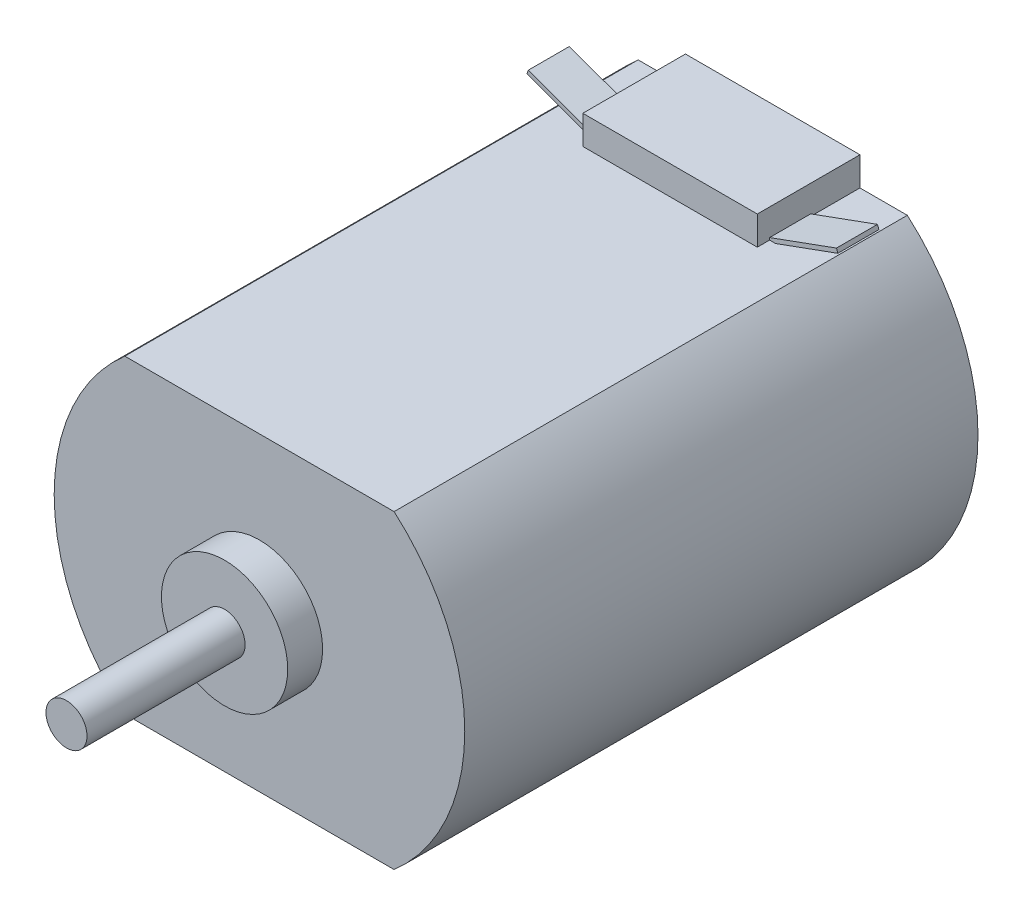
ISO-10303-21;
HEADER;
FILE_DESCRIPTION(('STEP AP214'),'2;1');
FILE_NAME('part.step','',(''),(''),'','','');
FILE_SCHEMA(('AUTOMOTIVE_DESIGN { 1 0 10303 214 1 1 1 1 }'));
ENDSEC;
DATA;
#1=APPLICATION_CONTEXT('core data for automotive mechanical design processes');
#2=APPLICATION_PROTOCOL_DEFINITION('international standard','automotive_design',2000,#1);
#3=PRODUCT_CONTEXT('',#1,'mechanical');
#4=PRODUCT('Part','Part','',(#3));
#5=PRODUCT_RELATED_PRODUCT_CATEGORY('part','',(#4));
#6=PRODUCT_DEFINITION_FORMATION('','',#4);
#7=PRODUCT_DEFINITION_CONTEXT('part definition',#1,'design');
#8=PRODUCT_DEFINITION('design','',#6,#7);
#9=PRODUCT_DEFINITION_SHAPE('','',#8);
#10=(LENGTH_UNIT() NAMED_UNIT(*) SI_UNIT(.MILLI.,.METRE.));
#11=(NAMED_UNIT(*) PLANE_ANGLE_UNIT() SI_UNIT($,.RADIAN.));
#12=(NAMED_UNIT(*) SI_UNIT($,.STERADIAN.) SOLID_ANGLE_UNIT());
#13=UNCERTAINTY_MEASURE_WITH_UNIT(LENGTH_MEASURE(1.E-05),#10,'distance_accuracy_value','');
#14=(GEOMETRIC_REPRESENTATION_CONTEXT(3) GLOBAL_UNCERTAINTY_ASSIGNED_CONTEXT((#13)) GLOBAL_UNIT_ASSIGNED_CONTEXT((#10,
#11,#12)) REPRESENTATION_CONTEXT('',''));
#15=CARTESIAN_POINT('',(0.,0.,0.));
#16=DIRECTION('',(0.,0.,1.));
#17=DIRECTION('',(1.,0.,0.));
#18=AXIS2_PLACEMENT_3D('',#15,#16,#17);
#19=CARTESIAN_POINT('',(-6.55724789831832,7.55,25.));
#20=DIRECTION('',(0.,-1.,0.));
#21=DIRECTION('',(0.,0.,-1.));
#22=AXIS2_PLACEMENT_3D('',#19,#20,#21);
#23=PLANE('',#22);
#24=DIRECTION('',(0.,0.,1.));
#25=VECTOR('',#24,1.);
#26=CARTESIAN_POINT('',(-4.25,7.55,5.));
#27=LINE('',#26,#25);
#28=CARTESIAN_POINT('',(-4.25,7.55,4.4));
#29=VERTEX_POINT('',#28);
#30=CARTESIAN_POINT('',(-4.25,7.55,5.));
#31=VERTEX_POINT('',#30);
#32=EDGE_CURVE('E256',#29,#31,#27,.T.);
#33=ORIENTED_EDGE('',*,*,#32,.F.);
#34=DIRECTION('',(-1.,0.,0.));
#35=VECTOR('',#34,1.);
#36=CARTESIAN_POINT('',(-6.55724789831831,7.55,4.4));
#37=LINE('',#36,#35);
#38=CARTESIAN_POINT('',(-4.54238044001631,7.55,4.4));
#39=VERTEX_POINT('',#38);
#40=EDGE_CURVE('E58',#29,#39,#37,.T.);
#41=ORIENTED_EDGE('',*,*,#40,.T.);
#42=DIRECTION('',(0.,0.,-1.));
#43=VECTOR('',#42,1.);
#44=CARTESIAN_POINT('',(-4.54238044001631,7.55,25.));
#45=LINE('',#44,#43);
#46=CARTESIAN_POINT('',(-4.54238044001631,7.55,2.4));
#47=VERTEX_POINT('',#46);
#48=EDGE_CURVE('E11',#39,#47,#45,.T.);
#49=ORIENTED_EDGE('',*,*,#48,.T.);
#50=DIRECTION('',(1.,0.,0.));
#51=VECTOR('',#50,1.);
#52=CARTESIAN_POINT('',(-6.55724789831831,7.55,2.4));
#53=LINE('',#52,#51);
#54=CARTESIAN_POINT('',(-4.25,7.55,2.4));
#55=VERTEX_POINT('',#54);
#56=EDGE_CURVE('E186',#47,#55,#53,.T.);
#57=ORIENTED_EDGE('',*,*,#56,.T.);
#58=CARTESIAN_POINT('',(-4.25,7.55,0.));
#59=VERTEX_POINT('',#58);
#60=EDGE_CURVE('E272',#59,#55,#27,.T.);
#61=ORIENTED_EDGE('',*,*,#60,.F.);
#62=DIRECTION('',(-1.,0.,0.));
#63=VECTOR('',#62,1.);
#64=CARTESIAN_POINT('',(-6.55724789831832,7.55,0.));
#65=LINE('',#64,#63);
#66=CARTESIAN_POINT('',(-6.55724789831832,7.55,0.));
#67=VERTEX_POINT('',#66);
#68=EDGE_CURVE('E362',#59,#67,#65,.T.);
#69=ORIENTED_EDGE('',*,*,#68,.T.);
#70=DIRECTION('',(0.,0.,-1.));
#71=VECTOR('',#70,1.);
#72=CARTESIAN_POINT('',(-6.55724789831832,7.55,25.));
#73=LINE('',#72,#71);
#74=CARTESIAN_POINT('',(-6.55724789831832,7.55,25.));
#75=VERTEX_POINT('',#74);
#76=EDGE_CURVE('E379',#75,#67,#73,.T.);
#77=ORIENTED_EDGE('',*,*,#76,.F.);
#78=DIRECTION('',(-1.,0.,0.));
#79=VECTOR('',#78,1.);
#80=CARTESIAN_POINT('',(-6.55724789831832,7.55,25.));
#81=LINE('',#80,#79);
#82=CARTESIAN_POINT('',(6.55724789831832,7.55,25.));
#83=VERTEX_POINT('',#82);
#84=EDGE_CURVE('E348',#83,#75,#81,.T.);
#85=ORIENTED_EDGE('',*,*,#84,.F.);
#86=DIRECTION('',(0.,0.,-1.));
#87=VECTOR('',#86,1.);
#88=CARTESIAN_POINT('',(6.55724789831832,7.55,25.));
#89=LINE('',#88,#87);
#90=CARTESIAN_POINT('',(6.55724789831832,7.55,0.));
#91=VERTEX_POINT('',#90);
#92=EDGE_CURVE('E383',#83,#91,#89,.T.);
#93=ORIENTED_EDGE('',*,*,#92,.T.);
#94=CARTESIAN_POINT('',(4.25,7.55,0.));
#95=VERTEX_POINT('',#94);
#96=EDGE_CURVE('E363',#91,#95,#65,.T.);
#97=ORIENTED_EDGE('',*,*,#96,.T.);
#98=DIRECTION('',(0.,0.,-1.));
#99=VECTOR('',#98,1.);
#100=CARTESIAN_POINT('',(4.25,7.55,5.));
#101=LINE('',#100,#99);
#102=CARTESIAN_POINT('',(4.25,7.55,2.4));
#103=VERTEX_POINT('',#102);
#104=EDGE_CURVE('E280',#103,#95,#101,.T.);
#105=ORIENTED_EDGE('',*,*,#104,.F.);
#106=DIRECTION('',(-1.,0.,0.));
#107=VECTOR('',#106,1.);
#108=CARTESIAN_POINT('',(-6.55724789831832,7.55,2.4));
#109=LINE('',#108,#107);
#110=CARTESIAN_POINT('',(4.54238044001631,7.55,2.4));
#111=VERTEX_POINT('',#110);
#112=EDGE_CURVE('E248',#111,#103,#109,.T.);
#113=ORIENTED_EDGE('',*,*,#112,.F.);
#114=DIRECTION('',(0.,0.,1.));
#115=VECTOR('',#114,1.);
#116=CARTESIAN_POINT('',(4.54238044001631,7.55,25.));
#117=LINE('',#116,#115);
#118=CARTESIAN_POINT('',(4.54238044001631,7.55,4.4));
#119=VERTEX_POINT('',#118);
#120=EDGE_CURVE('E402',#111,#119,#117,.T.);
#121=ORIENTED_EDGE('',*,*,#120,.T.);
#122=DIRECTION('',(1.,0.,0.));
#123=VECTOR('',#122,1.);
#124=CARTESIAN_POINT('',(-6.55724789831833,7.55,4.40000000000001));
#125=LINE('',#124,#123);
#126=CARTESIAN_POINT('',(4.25,7.55,4.4));
#127=VERTEX_POINT('',#126);
#128=EDGE_CURVE('E252',#127,#119,#125,.T.);
#129=ORIENTED_EDGE('',*,*,#128,.F.);
#130=CARTESIAN_POINT('',(4.25,7.55,5.));
#131=VERTEX_POINT('',#130);
#132=EDGE_CURVE('E262',#131,#127,#101,.T.);
#133=ORIENTED_EDGE('',*,*,#132,.F.);
#134=DIRECTION('',(1.,0.,0.));
#135=VECTOR('',#134,1.);
#136=CARTESIAN_POINT('',(4.25,7.55,5.));
#137=LINE('',#136,#135);
#138=EDGE_CURVE('E276',#31,#131,#137,.T.);
#139=ORIENTED_EDGE('',*,*,#138,.F.);
#140=EDGE_LOOP('',(#33,#41,#49,#57,#61,#69,#77,#85,#93,#97,#105,#113,#121,#129,#133,#139));
#141=FACE_BOUND('',#140,.T.);
#142=ADVANCED_FACE('F39',(#141),#23,.F.);
#143=CARTESIAN_POINT('',(4.25,8.95,5.));
#144=DIRECTION('',(-1.,0.,0.));
#145=DIRECTION('',(0.,0.,1.));
#146=AXIS2_PLACEMENT_3D('',#143,#144,#145);
#147=PLANE('',#146);
#148=DIRECTION('',(0.,-1.,0.));
#149=VECTOR('',#148,1.);
#150=CARTESIAN_POINT('',(4.25,8.95,4.4));
#151=LINE('',#150,#149);
#152=CARTESIAN_POINT('',(4.25,7.65641777724759,4.4));
#153=VERTEX_POINT('',#152);
#154=EDGE_CURVE('E398',#153,#127,#151,.T.);
#155=ORIENTED_EDGE('',*,*,#154,.F.);
#156=DIRECTION('',(0.,0.,1.));
#157=VECTOR('',#156,1.);
#158=CARTESIAN_POINT('',(4.25,7.65641777724759,5.));
#159=LINE('',#158,#157);
#160=CARTESIAN_POINT('',(4.25,7.65641777724759,2.4));
#161=VERTEX_POINT('',#160);
#162=EDGE_CURVE('E387',#161,#153,#159,.T.);
#163=ORIENTED_EDGE('',*,*,#162,.F.);
#164=DIRECTION('',(0.,1.,0.));
#165=VECTOR('',#164,1.);
#166=CARTESIAN_POINT('',(4.25,8.95,2.4));
#167=LINE('',#166,#165);
#168=EDGE_CURVE('E394',#103,#161,#167,.T.);
#169=ORIENTED_EDGE('',*,*,#168,.F.);
#170=ORIENTED_EDGE('',*,*,#104,.T.);
#171=DIRECTION('',(0.,-1.,0.));
#172=VECTOR('',#171,1.);
#173=CARTESIAN_POINT('',(4.25,8.95,0.));
#174=LINE('',#173,#172);
#175=CARTESIAN_POINT('',(4.25,8.95,0.));
#176=VERTEX_POINT('',#175);
#177=EDGE_CURVE('E287',#176,#95,#174,.T.);
#178=ORIENTED_EDGE('',*,*,#177,.F.);
#179=DIRECTION('',(0.,0.,-1.));
#180=VECTOR('',#179,1.);
#181=CARTESIAN_POINT('',(4.25,8.95,5.));
#182=LINE('',#181,#180);
#183=CARTESIAN_POINT('',(4.25,8.95,5.));
#184=VERTEX_POINT('',#183);
#185=EDGE_CURVE('E265',#184,#176,#182,.T.);
#186=ORIENTED_EDGE('',*,*,#185,.F.);
#187=DIRECTION('',(0.,-1.,0.));
#188=VECTOR('',#187,1.);
#189=CARTESIAN_POINT('',(4.25,8.95,5.));
#190=LINE('',#189,#188);
#191=EDGE_CURVE('E291',#184,#131,#190,.T.);
#192=ORIENTED_EDGE('',*,*,#191,.T.);
#193=ORIENTED_EDGE('',*,*,#132,.T.);
#194=EDGE_LOOP('',(#155,#163,#169,#170,#178,#186,#192,#193));
#195=FACE_BOUND('',#194,.T.);
#196=ADVANCED_FACE('F435',(#195),#147,.F.);
#197=CARTESIAN_POINT('',(0.,0.,0.));
#198=DIRECTION('',(0.,0.,1.));
#199=DIRECTION('',(1.,0.,0.));
#200=AXIS2_PLACEMENT_3D('',#197,#198,#199);
#201=PLANE('',#200);
#202=CARTESIAN_POINT('',(0.,0.,0.));
#203=DIRECTION('',(0.,0.,1.));
#204=DIRECTION('',(1.,0.,0.));
#205=AXIS2_PLACEMENT_3D('',#202,#203,#204);
#206=CIRCLE('',#205,10.);
#207=CARTESIAN_POINT('',(6.55724789831832,-7.55,0.));
#208=VERTEX_POINT('',#207);
#209=EDGE_CURVE('E343',#208,#91,#206,.T.);
#210=ORIENTED_EDGE('',*,*,#209,.F.);
#211=DIRECTION('',(1.,0.,0.));
#212=VECTOR('',#211,1.);
#213=CARTESIAN_POINT('',(-6.55724789831832,-7.55,0.));
#214=LINE('',#213,#212);
#215=CARTESIAN_POINT('',(-6.55724789831832,-7.55,0.));
#216=VERTEX_POINT('',#215);
#217=EDGE_CURVE('E349',#216,#208,#214,.T.);
#218=ORIENTED_EDGE('',*,*,#217,.F.);
#219=CARTESIAN_POINT('',(0.,0.,0.));
#220=DIRECTION('',(0.,0.,1.));
#221=DIRECTION('',(1.,0.,0.));
#222=AXIS2_PLACEMENT_3D('',#219,#220,#221);
#223=CIRCLE('',#222,10.);
#224=EDGE_CURVE('E367',#67,#216,#223,.T.);
#225=ORIENTED_EDGE('',*,*,#224,.F.);
#226=ORIENTED_EDGE('',*,*,#68,.F.);
#227=DIRECTION('',(0.,-1.,0.));
#228=VECTOR('',#227,1.);
#229=CARTESIAN_POINT('',(-4.25,8.95,0.));
#230=LINE('',#229,#228);
#231=CARTESIAN_POINT('',(-4.25,8.95,0.));
#232=VERTEX_POINT('',#231);
#233=EDGE_CURVE('E271',#232,#59,#230,.T.);
#234=ORIENTED_EDGE('',*,*,#233,.F.);
#235=DIRECTION('',(-1.,0.,0.));
#236=VECTOR('',#235,1.);
#237=CARTESIAN_POINT('',(4.25,8.95,0.));
#238=LINE('',#237,#236);
#239=EDGE_CURVE('E268',#176,#232,#238,.T.);
#240=ORIENTED_EDGE('',*,*,#239,.F.);
#241=ORIENTED_EDGE('',*,*,#177,.T.);
#242=ORIENTED_EDGE('',*,*,#96,.F.);
#243=EDGE_LOOP('',(#210,#218,#225,#226,#234,#240,#241,#242));
#244=FACE_BOUND('',#243,.T.);
#245=CARTESIAN_POINT('',(0.,0.,0.));
#246=DIRECTION('',(0.,0.,-1.));
#247=DIRECTION('',(-1.,0.,0.));
#248=AXIS2_PLACEMENT_3D('',#245,#246,#247);
#249=CIRCLE('',#248,5.);
#250=CARTESIAN_POINT('',(-3.52100837829165,-3.55,0.));
#251=VERTEX_POINT('',#250);
#252=CARTESIAN_POINT('',(3.52100837829165,-3.55,0.));
#253=VERTEX_POINT('',#252);
#254=EDGE_CURVE('E304',#251,#253,#249,.T.);
#255=ORIENTED_EDGE('',*,*,#254,.F.);
#256=DIRECTION('',(-1.,0.,0.));
#257=VECTOR('',#256,1.);
#258=CARTESIAN_POINT('',(3.52100837829165,-3.55,0.));
#259=LINE('',#258,#257);
#260=EDGE_CURVE('E313',#253,#251,#259,.T.);
#261=ORIENTED_EDGE('',*,*,#260,.F.);
#262=EDGE_LOOP('',(#255,#261));
#263=FACE_BOUND('',#262,.T.);
#264=ADVANCED_FACE('F439',(#244,#263),#201,.F.);
#265=CARTESIAN_POINT('',(0.,0.,25.));
#266=DIRECTION('',(0.,0.,-1.));
#267=DIRECTION('',(-1.,0.,0.));
#268=AXIS2_PLACEMENT_3D('',#265,#266,#267);
#269=CYLINDRICAL_SURFACE('',#268,10.);
#270=ORIENTED_EDGE('',*,*,#209,.T.);
#271=ORIENTED_EDGE('',*,*,#92,.F.);
#272=CARTESIAN_POINT('',(0.,0.,25.));
#273=DIRECTION('',(0.,0.,1.));
#274=DIRECTION('',(1.,0.,0.));
#275=AXIS2_PLACEMENT_3D('',#272,#273,#274);
#276=CIRCLE('',#275,10.);
#277=CARTESIAN_POINT('',(6.55724789831832,-7.55,25.));
#278=VERTEX_POINT('',#277);
#279=EDGE_CURVE('E344',#278,#83,#276,.T.);
#280=ORIENTED_EDGE('',*,*,#279,.F.);
#281=DIRECTION('',(0.,0.,-1.));
#282=VECTOR('',#281,1.);
#283=CARTESIAN_POINT('',(6.55724789831832,-7.55,25.));
#284=LINE('',#283,#282);
#285=EDGE_CURVE('E358',#278,#208,#284,.T.);
#286=ORIENTED_EDGE('',*,*,#285,.T.);
#287=EDGE_LOOP('',(#270,#271,#280,#286));
#288=FACE_BOUND('',#287,.T.);
#289=ADVANCED_FACE('F41',(#288),#269,.T.);
#290=CARTESIAN_POINT('',(0.,0.,25.));
#291=DIRECTION('',(0.,0.,-1.));
#292=DIRECTION('',(-1.,0.,0.));
#293=AXIS2_PLACEMENT_3D('',#290,#291,#292);
#294=CYLINDRICAL_SURFACE('',#293,10.);
#295=ORIENTED_EDGE('',*,*,#224,.T.);
#296=DIRECTION('',(0.,0.,-1.));
#297=VECTOR('',#296,1.);
#298=CARTESIAN_POINT('',(-6.55724789831832,-7.55,25.));
#299=LINE('',#298,#297);
#300=CARTESIAN_POINT('',(-6.55724789831832,-7.55,25.));
#301=VERTEX_POINT('',#300);
#302=EDGE_CURVE('E375',#301,#216,#299,.T.);
#303=ORIENTED_EDGE('',*,*,#302,.F.);
#304=CARTESIAN_POINT('',(0.,0.,25.));
#305=DIRECTION('',(0.,0.,1.));
#306=DIRECTION('',(1.,0.,0.));
#307=AXIS2_PLACEMENT_3D('',#304,#305,#306);
#308=CIRCLE('',#307,10.);
#309=EDGE_CURVE('E352',#75,#301,#308,.T.);
#310=ORIENTED_EDGE('',*,*,#309,.F.);
#311=ORIENTED_EDGE('',*,*,#76,.T.);
#312=EDGE_LOOP('',(#295,#303,#310,#311));
#313=FACE_BOUND('',#312,.T.);
#314=ADVANCED_FACE('F443',(#313),#294,.T.);
#315=CARTESIAN_POINT('',(-6.55724789831832,-7.55,25.));
#316=DIRECTION('',(0.,1.,0.));
#317=DIRECTION('',(0.,0.,1.));
#318=AXIS2_PLACEMENT_3D('',#315,#316,#317);
#319=PLANE('',#318);
#320=ORIENTED_EDGE('',*,*,#217,.T.);
#321=ORIENTED_EDGE('',*,*,#285,.F.);
#322=DIRECTION('',(1.,0.,0.));
#323=VECTOR('',#322,1.);
#324=CARTESIAN_POINT('',(-6.55724789831832,-7.55,25.));
#325=LINE('',#324,#323);
#326=EDGE_CURVE('E355',#301,#278,#325,.T.);
#327=ORIENTED_EDGE('',*,*,#326,.F.);
#328=ORIENTED_EDGE('',*,*,#302,.T.);
#329=EDGE_LOOP('',(#320,#321,#327,#328));
#330=FACE_BOUND('',#329,.T.);
#331=ADVANCED_FACE('F446',(#330),#319,.F.);
#332=CARTESIAN_POINT('',(0.,0.,25.));
#333=DIRECTION('',(0.,0.,1.));
#334=DIRECTION('',(1.,0.,0.));
#335=AXIS2_PLACEMENT_3D('',#332,#333,#334);
#336=PLANE('',#335);
#337=CARTESIAN_POINT('',(0.,0.,25.));
#338=DIRECTION('',(0.,0.,1.));
#339=DIRECTION('',(1.,0.,0.));
#340=AXIS2_PLACEMENT_3D('',#337,#338,#339);
#341=CIRCLE('',#340,3.075);
#342=CARTESIAN_POINT('',(3.075,0.,25.));
#343=VERTEX_POINT('',#342);
#344=EDGE_CURVE('E330',#343,#343,#341,.T.);
#345=ORIENTED_EDGE('',*,*,#344,.F.);
#346=EDGE_LOOP('',(#345));
#347=FACE_BOUND('',#346,.T.);
#348=ORIENTED_EDGE('',*,*,#279,.T.);
#349=ORIENTED_EDGE('',*,*,#84,.T.);
#350=ORIENTED_EDGE('',*,*,#309,.T.);
#351=ORIENTED_EDGE('',*,*,#326,.T.);
#352=EDGE_LOOP('',(#348,#349,#350,#351));
#353=FACE_BOUND('',#352,.T.);
#354=ADVANCED_FACE('F450',(#347,#353),#336,.T.);
#355=CARTESIAN_POINT('',(0.,0.,26.7));
#356=DIRECTION('',(0.,0.,-1.));
#357=DIRECTION('',(-1.,0.,0.));
#358=AXIS2_PLACEMENT_3D('',#355,#356,#357);
#359=CYLINDRICAL_SURFACE('',#358,3.075);
#360=CARTESIAN_POINT('',(0.,0.,26.7));
#361=DIRECTION('',(0.,0.,1.));
#362=DIRECTION('',(1.,0.,0.));
#363=AXIS2_PLACEMENT_3D('',#360,#361,#362);
#364=CIRCLE('',#363,3.075);
#365=CARTESIAN_POINT('',(3.075,0.,26.7));
#366=VERTEX_POINT('',#365);
#367=EDGE_CURVE('E331',#366,#366,#364,.T.);
#368=ORIENTED_EDGE('',*,*,#367,.F.);
#369=EDGE_LOOP('',(#368));
#370=FACE_BOUND('',#369,.T.);
#371=ORIENTED_EDGE('',*,*,#344,.T.);
#372=EDGE_LOOP('',(#371));
#373=FACE_BOUND('',#372,.T.);
#374=ADVANCED_FACE('F457',(#370,#373),#359,.T.);
#375=CARTESIAN_POINT('',(0.,0.,26.7));
#376=DIRECTION('',(0.,0.,1.));
#377=DIRECTION('',(1.,0.,0.));
#378=AXIS2_PLACEMENT_3D('',#375,#376,#377);
#379=PLANE('',#378);
#380=CARTESIAN_POINT('',(0.,0.,26.7));
#381=DIRECTION('',(0.,0.,1.));
#382=DIRECTION('',(1.,0.,0.));
#383=AXIS2_PLACEMENT_3D('',#380,#381,#382);
#384=CIRCLE('',#383,1.);
#385=CARTESIAN_POINT('',(1.,0.,26.7));
#386=VERTEX_POINT('',#385);
#387=EDGE_CURVE('E335',#386,#386,#384,.T.);
#388=ORIENTED_EDGE('',*,*,#387,.F.);
#389=EDGE_LOOP('',(#388));
#390=FACE_BOUND('',#389,.T.);
#391=ORIENTED_EDGE('',*,*,#367,.T.);
#392=EDGE_LOOP('',(#391));
#393=FACE_BOUND('',#392,.T.);
#394=ADVANCED_FACE('F467',(#390,#393),#379,.T.);
#395=CARTESIAN_POINT('',(0.,0.,34.4));
#396=DIRECTION('',(0.,0.,1.));
#397=DIRECTION('',(1.,0.,0.));
#398=AXIS2_PLACEMENT_3D('',#395,#396,#397);
#399=PLANE('',#398);
#400=CARTESIAN_POINT('',(0.,0.,34.4));
#401=DIRECTION('',(0.,0.,1.));
#402=DIRECTION('',(1.,0.,0.));
#403=AXIS2_PLACEMENT_3D('',#400,#401,#402);
#404=CIRCLE('',#403,1.);
#405=CARTESIAN_POINT('',(1.,0.,34.4));
#406=VERTEX_POINT('',#405);
#407=EDGE_CURVE('E339',#406,#406,#404,.T.);
#408=ORIENTED_EDGE('',*,*,#407,.T.);
#409=EDGE_LOOP('',(#408));
#410=FACE_BOUND('',#409,.T.);
#411=ADVANCED_FACE('F463',(#410),#399,.T.);
#412=CARTESIAN_POINT('',(0.,0.,34.4));
#413=DIRECTION('',(0.,0.,-1.));
#414=DIRECTION('',(-1.,0.,0.));
#415=AXIS2_PLACEMENT_3D('',#412,#413,#414);
#416=CYLINDRICAL_SURFACE('',#415,1.);
#417=ORIENTED_EDGE('',*,*,#387,.T.);
#418=EDGE_LOOP('',(#417));
#419=FACE_BOUND('',#418,.T.);
#420=ORIENTED_EDGE('',*,*,#407,.F.);
#421=EDGE_LOOP('',(#420));
#422=FACE_BOUND('',#421,.T.);
#423=ADVANCED_FACE('F459',(#419,#422),#416,.T.);
#424=CARTESIAN_POINT('',(0.,0.,-2.3));
#425=DIRECTION('',(0.,0.,1.));
#426=DIRECTION('',(1.,0.,0.));
#427=AXIS2_PLACEMENT_3D('',#424,#425,#426);
#428=CYLINDRICAL_SURFACE('',#427,5.);
#429=ORIENTED_EDGE('',*,*,#254,.T.);
#430=DIRECTION('',(0.,0.,1.));
#431=VECTOR('',#430,1.);
#432=CARTESIAN_POINT('',(3.52100837829165,-3.55,-2.3));
#433=LINE('',#432,#431);
#434=CARTESIAN_POINT('',(3.52100837829165,-3.55,-2.3));
#435=VERTEX_POINT('',#434);
#436=EDGE_CURVE('E326',#435,#253,#433,.T.);
#437=ORIENTED_EDGE('',*,*,#436,.F.);
#438=CARTESIAN_POINT('',(0.,0.,-2.3));
#439=DIRECTION('',(0.,0.,-1.));
#440=DIRECTION('',(-1.,0.,0.));
#441=AXIS2_PLACEMENT_3D('',#438,#439,#440);
#442=CIRCLE('',#441,5.);
#443=CARTESIAN_POINT('',(-3.52100837829165,-3.55,-2.3));
#444=VERTEX_POINT('',#443);
#445=EDGE_CURVE('E308',#444,#435,#442,.T.);
#446=ORIENTED_EDGE('',*,*,#445,.F.);
#447=DIRECTION('',(0.,0.,1.));
#448=VECTOR('',#447,1.);
#449=CARTESIAN_POINT('',(-3.52100837829165,-3.55,-2.3));
#450=LINE('',#449,#448);
#451=EDGE_CURVE('E316',#444,#251,#450,.T.);
#452=ORIENTED_EDGE('',*,*,#451,.T.);
#453=EDGE_LOOP('',(#429,#437,#446,#452));
#454=FACE_BOUND('',#453,.T.);
#455=ADVANCED_FACE('F462',(#454),#428,.T.);
#456=CARTESIAN_POINT('',(3.52100837829165,-3.55,-2.3));
#457=DIRECTION('',(0.,1.,0.));
#458=DIRECTION('',(0.,0.,1.));
#459=AXIS2_PLACEMENT_3D('',#456,#457,#458);
#460=PLANE('',#459);
#461=ORIENTED_EDGE('',*,*,#260,.T.);
#462=ORIENTED_EDGE('',*,*,#451,.F.);
#463=DIRECTION('',(-1.,0.,0.));
#464=VECTOR('',#463,1.);
#465=CARTESIAN_POINT('',(3.52100837829165,-3.55,-2.3));
#466=LINE('',#465,#464);
#467=EDGE_CURVE('E312',#435,#444,#466,.T.);
#468=ORIENTED_EDGE('',*,*,#467,.F.);
#469=ORIENTED_EDGE('',*,*,#436,.T.);
#470=EDGE_LOOP('',(#461,#462,#468,#469));
#471=FACE_BOUND('',#470,.T.);
#472=ADVANCED_FACE('F477',(#471),#460,.F.);
#473=CARTESIAN_POINT('',(0.,0.,-2.3));
#474=DIRECTION('',(0.,0.,-1.));
#475=DIRECTION('',(-1.,0.,0.));
#476=AXIS2_PLACEMENT_3D('',#473,#474,#475);
#477=PLANE('',#476);
#478=CARTESIAN_POINT('',(0.,0.,-2.3));
#479=DIRECTION('',(0.,0.,-1.));
#480=DIRECTION('',(-1.,0.,0.));
#481=AXIS2_PLACEMENT_3D('',#478,#479,#480);
#482=CIRCLE('',#481,1.);
#483=CARTESIAN_POINT('',(-1.,0.,-2.3));
#484=VERTEX_POINT('',#483);
#485=EDGE_CURVE('E299',#484,#484,#482,.T.);
#486=ORIENTED_EDGE('',*,*,#485,.F.);
#487=EDGE_LOOP('',(#486));
#488=FACE_BOUND('',#487,.T.);
#489=ORIENTED_EDGE('',*,*,#445,.T.);
#490=ORIENTED_EDGE('',*,*,#467,.T.);
#491=EDGE_LOOP('',(#489,#490));
#492=FACE_BOUND('',#491,.T.);
#493=ADVANCED_FACE('F481',(#488,#492),#477,.T.);
#494=CARTESIAN_POINT('',(0.,0.,-3.6));
#495=DIRECTION('',(0.,0.,1.));
#496=DIRECTION('',(1.,0.,0.));
#497=AXIS2_PLACEMENT_3D('',#494,#495,#496);
#498=CYLINDRICAL_SURFACE('',#497,1.);
#499=CARTESIAN_POINT('',(0.,0.,-3.6));
#500=DIRECTION('',(0.,0.,-1.));
#501=DIRECTION('',(-1.,0.,0.));
#502=AXIS2_PLACEMENT_3D('',#499,#500,#501);
#503=CIRCLE('',#502,1.);
#504=CARTESIAN_POINT('',(-1.,0.,-3.6));
#505=VERTEX_POINT('',#504);
#506=EDGE_CURVE('E300',#505,#505,#503,.T.);
#507=ORIENTED_EDGE('',*,*,#506,.F.);
#508=EDGE_LOOP('',(#507));
#509=FACE_BOUND('',#508,.T.);
#510=ORIENTED_EDGE('',*,*,#485,.T.);
#511=EDGE_LOOP('',(#510));
#512=FACE_BOUND('',#511,.T.);
#513=ADVANCED_FACE('F485',(#509,#512),#498,.T.);
#514=CARTESIAN_POINT('',(0.,0.,-3.6));
#515=DIRECTION('',(0.,0.,-1.));
#516=DIRECTION('',(-1.,0.,0.));
#517=AXIS2_PLACEMENT_3D('',#514,#515,#516);
#518=PLANE('',#517);
#519=ORIENTED_EDGE('',*,*,#506,.T.);
#520=EDGE_LOOP('',(#519));
#521=FACE_BOUND('',#520,.T.);
#522=ADVANCED_FACE('F489',(#521),#518,.T.);
#523=CARTESIAN_POINT('',(-4.25,8.95,5.));
#524=DIRECTION('',(1.,0.,0.));
#525=DIRECTION('',(0.,0.,-1.));
#526=AXIS2_PLACEMENT_3D('',#523,#524,#525);
#527=PLANE('',#526);
#528=DIRECTION('',(0.,0.,-1.));
#529=VECTOR('',#528,1.);
#530=CARTESIAN_POINT('',(-4.25,7.65641777724759,5.));
#531=LINE('',#530,#529);
#532=CARTESIAN_POINT('',(-4.25,7.65641777724759,4.4));
#533=VERTEX_POINT('',#532);
#534=CARTESIAN_POINT('',(-4.25,7.65641777724759,2.4));
#535=VERTEX_POINT('',#534);
#536=EDGE_CURVE('E195',#533,#535,#531,.T.);
#537=ORIENTED_EDGE('',*,*,#536,.F.);
#538=DIRECTION('',(0.,-1.,0.));
#539=VECTOR('',#538,1.);
#540=CARTESIAN_POINT('',(-4.25,8.95,4.4));
#541=LINE('',#540,#539);
#542=EDGE_CURVE('E48',#533,#29,#541,.T.);
#543=ORIENTED_EDGE('',*,*,#542,.T.);
#544=ORIENTED_EDGE('',*,*,#32,.T.);
#545=DIRECTION('',(0.,-1.,0.));
#546=VECTOR('',#545,1.);
#547=CARTESIAN_POINT('',(-4.25,8.95,5.));
#548=LINE('',#547,#546);
#549=CARTESIAN_POINT('',(-4.25,8.95,5.));
#550=VERTEX_POINT('',#549);
#551=EDGE_CURVE('E295',#550,#31,#548,.T.);
#552=ORIENTED_EDGE('',*,*,#551,.F.);
#553=DIRECTION('',(0.,0.,1.));
#554=VECTOR('',#553,1.);
#555=CARTESIAN_POINT('',(-4.25,8.95,5.));
#556=LINE('',#555,#554);
#557=EDGE_CURVE('E257',#232,#550,#556,.T.);
#558=ORIENTED_EDGE('',*,*,#557,.F.);
#559=ORIENTED_EDGE('',*,*,#233,.T.);
#560=ORIENTED_EDGE('',*,*,#60,.T.);
#561=DIRECTION('',(0.,1.,0.));
#562=VECTOR('',#561,1.);
#563=CARTESIAN_POINT('',(-4.25,8.95,2.4));
#564=LINE('',#563,#562);
#565=EDGE_CURVE('E407',#55,#535,#564,.T.);
#566=ORIENTED_EDGE('',*,*,#565,.T.);
#567=EDGE_LOOP('',(#537,#543,#544,#552,#558,#559,#560,#566));
#568=FACE_BOUND('',#567,.T.);
#569=ADVANCED_FACE('F412',(#568),#527,.F.);
#570=CARTESIAN_POINT('',(4.25,8.95,5.));
#571=DIRECTION('',(0.,0.,-1.));
#572=DIRECTION('',(-1.,0.,0.));
#573=AXIS2_PLACEMENT_3D('',#570,#571,#572);
#574=PLANE('',#573);
#575=ORIENTED_EDGE('',*,*,#138,.T.);
#576=ORIENTED_EDGE('',*,*,#191,.F.);
#577=DIRECTION('',(1.,0.,0.));
#578=VECTOR('',#577,1.);
#579=CARTESIAN_POINT('',(4.25,8.95,5.));
#580=LINE('',#579,#578);
#581=EDGE_CURVE('E261',#550,#184,#580,.T.);
#582=ORIENTED_EDGE('',*,*,#581,.F.);
#583=ORIENTED_EDGE('',*,*,#551,.T.);
#584=EDGE_LOOP('',(#575,#576,#582,#583));
#585=FACE_BOUND('',#584,.T.);
#586=ADVANCED_FACE('F496',(#585),#574,.F.);
#587=CARTESIAN_POINT('',(0.,8.95,0.));
#588=DIRECTION('',(0.,1.,0.));
#589=DIRECTION('',(0.,0.,1.));
#590=AXIS2_PLACEMENT_3D('',#587,#588,#589);
#591=PLANE('',#590);
#592=ORIENTED_EDGE('',*,*,#557,.T.);
#593=ORIENTED_EDGE('',*,*,#581,.T.);
#594=ORIENTED_EDGE('',*,*,#185,.T.);
#595=ORIENTED_EDGE('',*,*,#239,.T.);
#596=EDGE_LOOP('',(#592,#593,#594,#595));
#597=FACE_BOUND('',#596,.T.);
#598=ADVANCED_FACE('F498',(#597),#591,.T.);
#599=CARTESIAN_POINT('',(-1.89516565386195,5.20692484011164,0.));
#600=DIRECTION('',(0.34202014332567,-0.939692620785908,0.));
#601=DIRECTION('',(0.939692620785908,0.34202014332567,0.));
#602=AXIS2_PLACEMENT_3D('',#599,#600,#601);
#603=PLANE('',#602);
#604=ORIENTED_EDGE('',*,*,#120,.F.);
#605=DIRECTION('',(-0.939692620785908,-0.34202014332567,0.));
#606=VECTOR('',#605,1.);
#607=CARTESIAN_POINT('',(4.28420201433257,7.45603073792141,2.4));
#608=LINE('',#607,#606);
#609=CARTESIAN_POINT('',(7.57312618708324,8.65310123956125,2.4));
#610=VERTEX_POINT('',#609);
#611=EDGE_CURVE('E225',#610,#111,#608,.T.);
#612=ORIENTED_EDGE('',*,*,#611,.F.);
#613=DIRECTION('',(0.,0.,-1.));
#614=VECTOR('',#613,1.);
#615=CARTESIAN_POINT('',(7.57312618708324,8.65310123956125,2.4));
#616=LINE('',#615,#614);
#617=CARTESIAN_POINT('',(7.57312618708324,8.65310123956125,4.4));
#618=VERTEX_POINT('',#617);
#619=EDGE_CURVE('E235',#618,#610,#616,.T.);
#620=ORIENTED_EDGE('',*,*,#619,.F.);
#621=DIRECTION('',(0.939692620785908,0.34202014332567,0.));
#622=VECTOR('',#621,1.);
#623=CARTESIAN_POINT('',(4.28420201433257,7.45603073792141,4.4));
#624=LINE('',#623,#622);
#625=EDGE_CURVE('E220',#119,#618,#624,.T.);
#626=ORIENTED_EDGE('',*,*,#625,.F.);
#627=EDGE_LOOP('',(#604,#612,#620,#626));
#628=FACE_BOUND('',#627,.T.);
#629=ADVANCED_FACE('F503',(#628),#603,.T.);
#630=CARTESIAN_POINT('',(4.21579798566743,7.64396926207859,4.4));
#631=DIRECTION('',(0.,0.,-1.));
#632=DIRECTION('',(-1.,0.,0.));
#633=AXIS2_PLACEMENT_3D('',#630,#631,#632);
#634=PLANE('',#633);
#635=ORIENTED_EDGE('',*,*,#154,.T.);
#636=ORIENTED_EDGE('',*,*,#128,.T.);
#637=ORIENTED_EDGE('',*,*,#625,.T.);
#638=DIRECTION('',(0.342020143325669,-0.939692620785908,0.));
#639=VECTOR('',#638,1.);
#640=CARTESIAN_POINT('',(7.50472215841811,8.84103976371843,4.4));
#641=LINE('',#640,#639);
#642=CARTESIAN_POINT('',(7.50472215841811,8.84103976371843,4.4));
#643=VERTEX_POINT('',#642);
#644=EDGE_CURVE('E244',#643,#618,#641,.T.);
#645=ORIENTED_EDGE('',*,*,#644,.F.);
#646=DIRECTION('',(0.939692620785908,0.34202014332567,0.));
#647=VECTOR('',#646,1.);
#648=CARTESIAN_POINT('',(4.21579798566743,7.64396926207859,4.4));
#649=LINE('',#648,#647);
#650=EDGE_CURVE('E221',#153,#643,#649,.T.);
#651=ORIENTED_EDGE('',*,*,#650,.F.);
#652=EDGE_LOOP('',(#635,#636,#637,#645,#651));
#653=FACE_BOUND('',#652,.T.);
#654=ADVANCED_FACE('F505',(#653),#634,.F.);
#655=CARTESIAN_POINT('',(4.21579798566743,7.64396926207859,2.4));
#656=DIRECTION('',(0.,0.,1.));
#657=DIRECTION('',(1.,0.,0.));
#658=AXIS2_PLACEMENT_3D('',#655,#656,#657);
#659=PLANE('',#658);
#660=ORIENTED_EDGE('',*,*,#611,.T.);
#661=ORIENTED_EDGE('',*,*,#112,.T.);
#662=ORIENTED_EDGE('',*,*,#168,.T.);
#663=DIRECTION('',(-0.939692620785908,-0.34202014332567,0.));
#664=VECTOR('',#663,1.);
#665=CARTESIAN_POINT('',(4.21579798566743,7.64396926207859,2.4));
#666=LINE('',#665,#664);
#667=CARTESIAN_POINT('',(7.50472215841811,8.84103976371843,2.4));
#668=VERTEX_POINT('',#667);
#669=EDGE_CURVE('E228',#668,#161,#666,.T.);
#670=ORIENTED_EDGE('',*,*,#669,.F.);
#671=DIRECTION('',(0.342020143325669,-0.939692620785908,0.));
#672=VECTOR('',#671,1.);
#673=CARTESIAN_POINT('',(7.50472215841811,8.84103976371843,2.4));
#674=LINE('',#673,#672);
#675=EDGE_CURVE('E232',#668,#610,#674,.T.);
#676=ORIENTED_EDGE('',*,*,#675,.T.);
#677=EDGE_LOOP('',(#660,#661,#662,#670,#676));
#678=FACE_BOUND('',#677,.T.);
#679=ADVANCED_FACE('F507',(#678),#659,.F.);
#680=CARTESIAN_POINT('',(-1.96356968252708,5.39486336426883,0.));
#681=DIRECTION('',(0.34202014332567,-0.939692620785908,0.));
#682=DIRECTION('',(0.939692620785908,0.34202014332567,0.));
#683=AXIS2_PLACEMENT_3D('',#680,#681,#682);
#684=PLANE('',#683);
#685=ORIENTED_EDGE('',*,*,#669,.T.);
#686=ORIENTED_EDGE('',*,*,#162,.T.);
#687=ORIENTED_EDGE('',*,*,#650,.T.);
#688=DIRECTION('',(0.,0.,-1.));
#689=VECTOR('',#688,1.);
#690=CARTESIAN_POINT('',(7.50472215841811,8.84103976371843,2.4));
#691=LINE('',#690,#689);
#692=EDGE_CURVE('E224',#643,#668,#691,.T.);
#693=ORIENTED_EDGE('',*,*,#692,.T.);
#694=EDGE_LOOP('',(#685,#686,#687,#693));
#695=FACE_BOUND('',#694,.T.);
#696=ADVANCED_FACE('F429',(#695),#684,.F.);
#697=CARTESIAN_POINT('',(7.50472215841811,8.84103976371843,2.4));
#698=DIRECTION('',(-0.939692620785908,-0.342020143325669,0.));
#699=DIRECTION('',(0.342020143325669,-0.939692620785908,0.));
#700=AXIS2_PLACEMENT_3D('',#697,#698,#699);
#701=PLANE('',#700);
#702=ORIENTED_EDGE('',*,*,#619,.T.);
#703=ORIENTED_EDGE('',*,*,#675,.F.);
#704=ORIENTED_EDGE('',*,*,#692,.F.);
#705=ORIENTED_EDGE('',*,*,#644,.T.);
#706=EDGE_LOOP('',(#702,#703,#704,#705));
#707=FACE_BOUND('',#706,.T.);
#708=ADVANCED_FACE('F422',(#707),#701,.F.);
#709=CARTESIAN_POINT('',(1.89516565386195,5.20692484011164,0.));
#710=DIRECTION('',(-0.34202014332567,-0.939692620785908,0.));
#711=DIRECTION('',(-0.939692620785908,0.34202014332567,0.));
#712=AXIS2_PLACEMENT_3D('',#709,#710,#711);
#713=PLANE('',#712);
#714=ORIENTED_EDGE('',*,*,#48,.F.);
#715=DIRECTION('',(-0.939692620785908,0.34202014332567,0.));
#716=VECTOR('',#715,1.);
#717=CARTESIAN_POINT('',(-4.28420201433257,7.45603073792141,4.4));
#718=LINE('',#717,#716);
#719=CARTESIAN_POINT('',(-7.57312618708324,8.65310123956125,4.4));
#720=VERTEX_POINT('',#719);
#721=EDGE_CURVE('E208',#39,#720,#718,.T.);
#722=ORIENTED_EDGE('',*,*,#721,.T.);
#723=DIRECTION('',(0.,0.,-1.));
#724=VECTOR('',#723,1.);
#725=CARTESIAN_POINT('',(-7.57312618708324,8.65310123956125,2.4));
#726=LINE('',#725,#724);
#727=CARTESIAN_POINT('',(-7.57312618708324,8.65310123956125,2.4));
#728=VERTEX_POINT('',#727);
#729=EDGE_CURVE('E213',#720,#728,#726,.T.);
#730=ORIENTED_EDGE('',*,*,#729,.T.);
#731=DIRECTION('',(0.939692620785908,-0.34202014332567,0.));
#732=VECTOR('',#731,1.);
#733=CARTESIAN_POINT('',(-4.28420201433257,7.45603073792141,2.4));
#734=LINE('',#733,#732);
#735=EDGE_CURVE('E180',#728,#47,#734,.T.);
#736=ORIENTED_EDGE('',*,*,#735,.T.);
#737=EDGE_LOOP('',(#714,#722,#730,#736));
#738=FACE_BOUND('',#737,.T.);
#739=ADVANCED_FACE('F420',(#738),#713,.T.);
#740=CARTESIAN_POINT('',(-4.21579798566743,7.64396926207859,4.4));
#741=DIRECTION('',(0.,0.,1.));
#742=DIRECTION('',(1.,0.,0.));
#743=AXIS2_PLACEMENT_3D('',#740,#741,#742);
#744=PLANE('',#743);
#745=ORIENTED_EDGE('',*,*,#40,.F.);
#746=ORIENTED_EDGE('',*,*,#542,.F.);
#747=DIRECTION('',(-0.939692620785908,0.34202014332567,0.));
#748=VECTOR('',#747,1.);
#749=CARTESIAN_POINT('',(-4.21579798566743,7.64396926207859,4.4));
#750=LINE('',#749,#748);
#751=CARTESIAN_POINT('',(-7.50472215841811,8.84103976371843,4.4));
#752=VERTEX_POINT('',#751);
#753=EDGE_CURVE('E197',#533,#752,#750,.T.);
#754=ORIENTED_EDGE('',*,*,#753,.T.);
#755=DIRECTION('',(-0.342020143325669,-0.939692620785908,0.));
#756=VECTOR('',#755,1.);
#757=CARTESIAN_POINT('',(-7.50472215841811,8.84103976371843,4.4));
#758=LINE('',#757,#756);
#759=EDGE_CURVE('E187',#752,#720,#758,.T.);
#760=ORIENTED_EDGE('',*,*,#759,.T.);
#761=ORIENTED_EDGE('',*,*,#721,.F.);
#762=EDGE_LOOP('',(#745,#746,#754,#760,#761));
#763=FACE_BOUND('',#762,.T.);
#764=ADVANCED_FACE('F418',(#763),#744,.T.);
#765=CARTESIAN_POINT('',(-4.21579798566743,7.64396926207859,2.4));
#766=DIRECTION('',(0.,0.,-1.));
#767=DIRECTION('',(-1.,0.,0.));
#768=AXIS2_PLACEMENT_3D('',#765,#766,#767);
#769=PLANE('',#768);
#770=ORIENTED_EDGE('',*,*,#56,.F.);
#771=ORIENTED_EDGE('',*,*,#735,.F.);
#772=DIRECTION('',(-0.342020143325669,-0.939692620785908,0.));
#773=VECTOR('',#772,1.);
#774=CARTESIAN_POINT('',(-7.50472215841811,8.84103976371843,2.4));
#775=LINE('',#774,#773);
#776=CARTESIAN_POINT('',(-7.50472215841811,8.84103976371843,2.4));
#777=VERTEX_POINT('',#776);
#778=EDGE_CURVE('E174',#777,#728,#775,.T.);
#779=ORIENTED_EDGE('',*,*,#778,.F.);
#780=DIRECTION('',(0.939692620785908,-0.34202014332567,0.));
#781=VECTOR('',#780,1.);
#782=CARTESIAN_POINT('',(-4.21579798566743,7.64396926207859,2.4));
#783=LINE('',#782,#781);
#784=EDGE_CURVE('E178',#777,#535,#783,.T.);
#785=ORIENTED_EDGE('',*,*,#784,.T.);
#786=ORIENTED_EDGE('',*,*,#565,.F.);
#787=EDGE_LOOP('',(#770,#771,#779,#785,#786));
#788=FACE_BOUND('',#787,.T.);
#789=ADVANCED_FACE('F176',(#788),#769,.T.);
#790=CARTESIAN_POINT('',(1.96356968252708,5.39486336426883,0.));
#791=DIRECTION('',(-0.34202014332567,-0.939692620785908,0.));
#792=DIRECTION('',(-0.939692620785908,0.34202014332567,0.));
#793=AXIS2_PLACEMENT_3D('',#790,#791,#792);
#794=PLANE('',#793);
#795=ORIENTED_EDGE('',*,*,#753,.F.);
#796=ORIENTED_EDGE('',*,*,#536,.T.);
#797=ORIENTED_EDGE('',*,*,#784,.F.);
#798=DIRECTION('',(0.,0.,-1.));
#799=VECTOR('',#798,1.);
#800=CARTESIAN_POINT('',(-7.50472215841811,8.84103976371843,2.4));
#801=LINE('',#800,#799);
#802=EDGE_CURVE('E194',#752,#777,#801,.T.);
#803=ORIENTED_EDGE('',*,*,#802,.F.);
#804=EDGE_LOOP('',(#795,#796,#797,#803));
#805=FACE_BOUND('',#804,.T.);
#806=ADVANCED_FACE('F193',(#805),#794,.F.);
#807=CARTESIAN_POINT('',(-7.50472215841811,8.84103976371843,2.4));
#808=DIRECTION('',(-0.939692620785908,0.342020143325669,0.));
#809=DIRECTION('',(-0.342020143325669,-0.939692620785908,0.));
#810=AXIS2_PLACEMENT_3D('',#807,#808,#809);
#811=PLANE('',#810);
#812=ORIENTED_EDGE('',*,*,#729,.F.);
#813=ORIENTED_EDGE('',*,*,#759,.F.);
#814=ORIENTED_EDGE('',*,*,#802,.T.);
#815=ORIENTED_EDGE('',*,*,#778,.T.);
#816=EDGE_LOOP('',(#812,#813,#814,#815));
#817=FACE_BOUND('',#816,.T.);
#818=ADVANCED_FACE('F200',(#817),#811,.T.);
#819=CLOSED_SHELL('',(#142,#196,#264,#289,#314,#331,#354,#374,#394,#411,#423,#455,#472,#493,
#513,#522,#569,#586,#598,#629,#654,#679,#696,#708,#739,#764,#789,#806,#818));
#820=MANIFOLD_SOLID_BREP('B2',#819);
#821=ADVANCED_BREP_SHAPE_REPRESENTATION('',(#18,#820),#14);
#822=SHAPE_DEFINITION_REPRESENTATION(#9,#821);
ENDSEC;
END-ISO-10303-21;
